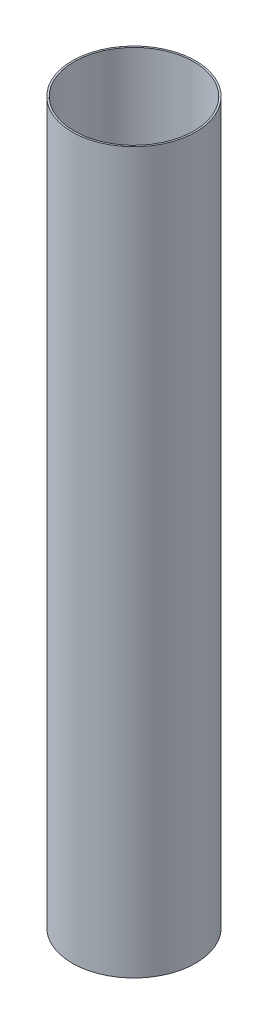
ISO-10303-21;
HEADER;
FILE_DESCRIPTION(('STEP AP214'),'2;1');
FILE_NAME('part.step','',(''),(''),'','','');
FILE_SCHEMA(('AUTOMOTIVE_DESIGN { 1 0 10303 214 1 1 1 1 }'));
ENDSEC;
DATA;
#1=APPLICATION_CONTEXT('core data for automotive mechanical design processes');
#2=APPLICATION_PROTOCOL_DEFINITION('international standard','automotive_design',2000,#1);
#3=PRODUCT_CONTEXT('',#1,'mechanical');
#4=PRODUCT('Part','Part','',(#3));
#5=PRODUCT_RELATED_PRODUCT_CATEGORY('part','',(#4));
#6=PRODUCT_DEFINITION_FORMATION('','',#4);
#7=PRODUCT_DEFINITION_CONTEXT('part definition',#1,'design');
#8=PRODUCT_DEFINITION('design','',#6,#7);
#9=PRODUCT_DEFINITION_SHAPE('','',#8);
#10=(LENGTH_UNIT() NAMED_UNIT(*) SI_UNIT(.MILLI.,.METRE.));
#11=(NAMED_UNIT(*) PLANE_ANGLE_UNIT() SI_UNIT($,.RADIAN.));
#12=(NAMED_UNIT(*) SI_UNIT($,.STERADIAN.) SOLID_ANGLE_UNIT());
#13=UNCERTAINTY_MEASURE_WITH_UNIT(LENGTH_MEASURE(1.E-05),#10,'distance_accuracy_value','');
#14=(GEOMETRIC_REPRESENTATION_CONTEXT(3) GLOBAL_UNCERTAINTY_ASSIGNED_CONTEXT((#13)) GLOBAL_UNIT_ASSIGNED_CONTEXT((#10,
#11,#12)) REPRESENTATION_CONTEXT('',''));
#15=CARTESIAN_POINT('',(0.,0.,0.));
#16=DIRECTION('',(0.,0.,1.));
#17=DIRECTION('',(1.,0.,0.));
#18=AXIS2_PLACEMENT_3D('',#15,#16,#17);
#19=CARTESIAN_POINT('',(0.,914.4,0.));
#20=DIRECTION('',(0.,1.,0.));
#21=DIRECTION('',(0.,0.,1.));
#22=AXIS2_PLACEMENT_3D('',#19,#20,#21);
#23=PLANE('',#22);
#24=CARTESIAN_POINT('',(0.,914.4,0.));
#25=DIRECTION('',(0.,1.,0.));
#26=DIRECTION('',(0.,0.,1.));
#27=AXIS2_PLACEMENT_3D('',#24,#25,#26);
#28=CIRCLE('',#27,78.359);
#29=CARTESIAN_POINT('',(0.,914.4,78.359));
#30=VERTEX_POINT('',#29);
#31=EDGE_CURVE('E10',#30,#30,#28,.T.);
#32=ORIENTED_EDGE('',*,*,#31,.T.);
#33=EDGE_LOOP('',(#32));
#34=FACE_BOUND('',#33,.T.);
#35=CARTESIAN_POINT('',(0.,914.4,0.));
#36=DIRECTION('',(0.,1.,0.));
#37=DIRECTION('',(0.,0.,1.));
#38=AXIS2_PLACEMENT_3D('',#35,#36,#37);
#39=CIRCLE('',#38,76.2);
#40=CARTESIAN_POINT('',(0.,914.4,76.2));
#41=VERTEX_POINT('',#40);
#42=EDGE_CURVE('E42',#41,#41,#39,.T.);
#43=ORIENTED_EDGE('',*,*,#42,.F.);
#44=EDGE_LOOP('',(#43));
#45=FACE_BOUND('',#44,.T.);
#46=ADVANCED_FACE('F31',(#34,#45),#23,.T.);
#47=CARTESIAN_POINT('',(0.,0.,0.));
#48=DIRECTION('',(0.,1.,0.));
#49=DIRECTION('',(0.,0.,1.));
#50=AXIS2_PLACEMENT_3D('',#47,#48,#49);
#51=PLANE('',#50);
#52=CARTESIAN_POINT('',(0.,0.,0.));
#53=DIRECTION('',(0.,1.,0.));
#54=DIRECTION('',(0.,0.,1.));
#55=AXIS2_PLACEMENT_3D('',#52,#53,#54);
#56=CIRCLE('',#55,78.359);
#57=CARTESIAN_POINT('',(0.,0.,78.359));
#58=VERTEX_POINT('',#57);
#59=EDGE_CURVE('E35',#58,#58,#56,.T.);
#60=ORIENTED_EDGE('',*,*,#59,.F.);
#61=EDGE_LOOP('',(#60));
#62=FACE_BOUND('',#61,.T.);
#63=CARTESIAN_POINT('',(0.,0.,0.));
#64=DIRECTION('',(0.,1.,0.));
#65=DIRECTION('',(0.,0.,1.));
#66=AXIS2_PLACEMENT_3D('',#63,#64,#65);
#67=CIRCLE('',#66,76.2);
#68=CARTESIAN_POINT('',(0.,0.,76.2));
#69=VERTEX_POINT('',#68);
#70=EDGE_CURVE('E44',#69,#69,#67,.T.);
#71=ORIENTED_EDGE('',*,*,#70,.T.);
#72=EDGE_LOOP('',(#71));
#73=FACE_BOUND('',#72,.T.);
#74=ADVANCED_FACE('F54',(#62,#73),#51,.F.);
#75=CARTESIAN_POINT('',(0.,914.4,0.));
#76=DIRECTION('',(0.,-1.,0.));
#77=DIRECTION('',(0.,0.,-1.));
#78=AXIS2_PLACEMENT_3D('',#75,#76,#77);
#79=CYLINDRICAL_SURFACE('',#78,78.359);
#80=ORIENTED_EDGE('',*,*,#31,.F.);
#81=EDGE_LOOP('',(#80));
#82=FACE_BOUND('',#81,.T.);
#83=ORIENTED_EDGE('',*,*,#59,.T.);
#84=EDGE_LOOP('',(#83));
#85=FACE_BOUND('',#84,.T.);
#86=ADVANCED_FACE('F33',(#82,#85),#79,.T.);
#87=CARTESIAN_POINT('',(0.,914.4,0.));
#88=DIRECTION('',(0.,-1.,0.));
#89=DIRECTION('',(0.,0.,-1.));
#90=AXIS2_PLACEMENT_3D('',#87,#88,#89);
#91=CYLINDRICAL_SURFACE('',#90,76.2);
#92=ORIENTED_EDGE('',*,*,#42,.T.);
#93=EDGE_LOOP('',(#92));
#94=FACE_BOUND('',#93,.T.);
#95=ORIENTED_EDGE('',*,*,#70,.F.);
#96=EDGE_LOOP('',(#95));
#97=FACE_BOUND('',#96,.T.);
#98=ADVANCED_FACE('F50',(#94,#97),#91,.F.);
#99=CLOSED_SHELL('',(#46,#74,#86,#98));
#100=MANIFOLD_SOLID_BREP('B2',#99);
#101=ADVANCED_BREP_SHAPE_REPRESENTATION('',(#18,#100),#14);
#102=SHAPE_DEFINITION_REPRESENTATION(#9,#101);
ENDSEC;
END-ISO-10303-21;
